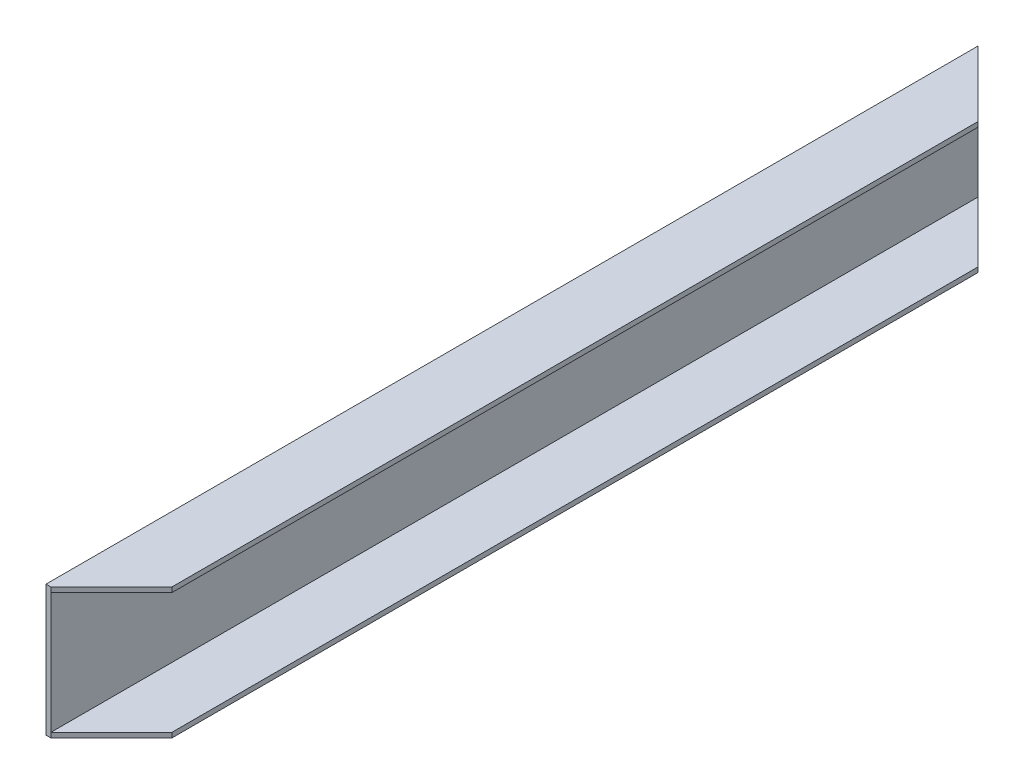
ISO-10303-21;
HEADER;
FILE_DESCRIPTION(('STEP AP214'),'2;1');
FILE_NAME('part.step','',(''),(''),'','','');
FILE_SCHEMA(('AUTOMOTIVE_DESIGN { 1 0 10303 214 1 1 1 1 }'));
ENDSEC;
DATA;
#1=APPLICATION_CONTEXT('core data for automotive mechanical design processes');
#2=APPLICATION_PROTOCOL_DEFINITION('international standard','automotive_design',2000,#1);
#3=PRODUCT_CONTEXT('',#1,'mechanical');
#4=PRODUCT('Part','Part','',(#3));
#5=PRODUCT_RELATED_PRODUCT_CATEGORY('part','',(#4));
#6=PRODUCT_DEFINITION_FORMATION('','',#4);
#7=PRODUCT_DEFINITION_CONTEXT('part definition',#1,'design');
#8=PRODUCT_DEFINITION('design','',#6,#7);
#9=PRODUCT_DEFINITION_SHAPE('','',#8);
#10=(LENGTH_UNIT() NAMED_UNIT(*) SI_UNIT(.MILLI.,.METRE.));
#11=(NAMED_UNIT(*) PLANE_ANGLE_UNIT() SI_UNIT($,.RADIAN.));
#12=(NAMED_UNIT(*) SI_UNIT($,.STERADIAN.) SOLID_ANGLE_UNIT());
#13=UNCERTAINTY_MEASURE_WITH_UNIT(LENGTH_MEASURE(1.E-05),#10,'distance_accuracy_value','');
#14=(GEOMETRIC_REPRESENTATION_CONTEXT(3) GLOBAL_UNCERTAINTY_ASSIGNED_CONTEXT((#13)) GLOBAL_UNIT_ASSIGNED_CONTEXT((#10,
#11,#12)) REPRESENTATION_CONTEXT('',''));
#15=CARTESIAN_POINT('',(0.,0.,0.));
#16=DIRECTION('',(0.,0.,1.));
#17=DIRECTION('',(1.,0.,0.));
#18=AXIS2_PLACEMENT_3D('',#15,#16,#17);
#19=CARTESIAN_POINT('',(0.,20.,142.5));
#20=DIRECTION('',(0.,-1.,0.));
#21=DIRECTION('',(0.,0.,-1.));
#22=AXIS2_PLACEMENT_3D('',#19,#20,#21);
#23=PLANE('',#22);
#24=DIRECTION('',(-1.,0.,0.));
#25=VECTOR('',#24,1.);
#26=CARTESIAN_POINT('',(0.,20.,142.5));
#27=LINE('',#26,#25);
#28=CARTESIAN_POINT('',(1.5,20.,142.5));
#29=VERTEX_POINT('',#28);
#30=CARTESIAN_POINT('',(0.,20.,142.5));
#31=VERTEX_POINT('',#30);
#32=EDGE_CURVE('E113',#29,#31,#27,.T.);
#33=ORIENTED_EDGE('',*,*,#32,.F.);
#34=DIRECTION('',(0.707106781186548,0.,-0.707106781186548));
#35=VECTOR('',#34,1.);
#36=CARTESIAN_POINT('',(0.750000000000004,20.,143.25));
#37=LINE('',#36,#35);
#38=CARTESIAN_POINT('',(20.,20.,124.));
#39=VERTEX_POINT('',#38);
#40=EDGE_CURVE('E47',#29,#39,#37,.T.);
#41=ORIENTED_EDGE('',*,*,#40,.T.);
#42=DIRECTION('',(0.,0.,-1.));
#43=VECTOR('',#42,1.);
#44=CARTESIAN_POINT('',(20.,20.,142.5));
#45=LINE('',#44,#43);
#46=CARTESIAN_POINT('',(20.,20.,-122.5));
#47=VERTEX_POINT('',#46);
#48=EDGE_CURVE('E121',#39,#47,#45,.T.);
#49=ORIENTED_EDGE('',*,*,#48,.T.);
#50=DIRECTION('',(-0.707106781186548,0.,-0.707106781186547));
#51=VECTOR('',#50,1.);
#52=CARTESIAN_POINT('',(142.5,20.,0.));
#53=LINE('',#52,#51);
#54=CARTESIAN_POINT('',(0.,20.,-142.5));
#55=VERTEX_POINT('',#54);
#56=EDGE_CURVE('E107',#47,#55,#53,.T.);
#57=ORIENTED_EDGE('',*,*,#56,.T.);
#58=DIRECTION('',(0.,0.,-1.));
#59=VECTOR('',#58,1.);
#60=CARTESIAN_POINT('',(0.,20.,142.5));
#61=LINE('',#60,#59);
#62=EDGE_CURVE('E119',#31,#55,#61,.T.);
#63=ORIENTED_EDGE('',*,*,#62,.F.);
#64=EDGE_LOOP('',(#33,#41,#49,#57,#63));
#65=FACE_BOUND('',#64,.T.);
#66=ADVANCED_FACE('F33',(#65),#23,.F.);
#67=CARTESIAN_POINT('',(0.,20.,142.5));
#68=DIRECTION('',(1.,0.,0.));
#69=DIRECTION('',(0.,0.,-1.));
#70=AXIS2_PLACEMENT_3D('',#67,#68,#69);
#71=PLANE('',#70);
#72=DIRECTION('',(0.,-1.,0.));
#73=VECTOR('',#72,1.);
#74=CARTESIAN_POINT('',(0.,20.,-142.5));
#75=LINE('',#74,#73);
#76=CARTESIAN_POINT('',(0.,-20.,-142.5));
#77=VERTEX_POINT('',#76);
#78=EDGE_CURVE('E104',#55,#77,#75,.T.);
#79=ORIENTED_EDGE('',*,*,#78,.T.);
#80=DIRECTION('',(0.,0.,-1.));
#81=VECTOR('',#80,1.);
#82=CARTESIAN_POINT('',(0.,-20.,142.5));
#83=LINE('',#82,#81);
#84=CARTESIAN_POINT('',(0.,-20.,142.5));
#85=VERTEX_POINT('',#84);
#86=EDGE_CURVE('E127',#85,#77,#83,.T.);
#87=ORIENTED_EDGE('',*,*,#86,.F.);
#88=DIRECTION('',(0.,-1.,0.));
#89=VECTOR('',#88,1.);
#90=CARTESIAN_POINT('',(0.,20.,142.5));
#91=LINE('',#90,#89);
#92=EDGE_CURVE('E126',#31,#85,#91,.T.);
#93=ORIENTED_EDGE('',*,*,#92,.F.);
#94=ORIENTED_EDGE('',*,*,#62,.T.);
#95=EDGE_LOOP('',(#79,#87,#93,#94));
#96=FACE_BOUND('',#95,.T.);
#97=ADVANCED_FACE('F125',(#96),#71,.F.);
#98=CARTESIAN_POINT('',(0.,-20.,142.5));
#99=DIRECTION('',(0.,1.,0.));
#100=DIRECTION('',(0.,0.,1.));
#101=AXIS2_PLACEMENT_3D('',#98,#99,#100);
#102=PLANE('',#101);
#103=DIRECTION('',(0.,0.,-1.));
#104=VECTOR('',#103,1.);
#105=CARTESIAN_POINT('',(20.,-20.,142.5));
#106=LINE('',#105,#104);
#107=CARTESIAN_POINT('',(20.,-20.,124.));
#108=VERTEX_POINT('',#107);
#109=CARTESIAN_POINT('',(20.,-20.,-122.5));
#110=VERTEX_POINT('',#109);
#111=EDGE_CURVE('E128',#108,#110,#106,.T.);
#112=ORIENTED_EDGE('',*,*,#111,.F.);
#113=DIRECTION('',(-0.707106781186548,0.,0.707106781186548));
#114=VECTOR('',#113,1.);
#115=CARTESIAN_POINT('',(0.750000000000004,-20.,143.25));
#116=LINE('',#115,#114);
#117=CARTESIAN_POINT('',(1.5,-20.,142.5));
#118=VERTEX_POINT('',#117);
#119=EDGE_CURVE('E155',#108,#118,#116,.T.);
#120=ORIENTED_EDGE('',*,*,#119,.T.);
#121=DIRECTION('',(1.,0.,0.));
#122=VECTOR('',#121,1.);
#123=CARTESIAN_POINT('',(0.,-20.,142.5));
#124=LINE('',#123,#122);
#125=EDGE_CURVE('E149',#85,#118,#124,.T.);
#126=ORIENTED_EDGE('',*,*,#125,.F.);
#127=ORIENTED_EDGE('',*,*,#86,.T.);
#128=DIRECTION('',(0.707106781186548,0.,0.707106781186547));
#129=VECTOR('',#128,1.);
#130=CARTESIAN_POINT('',(142.5,-20.,0.));
#131=LINE('',#130,#129);
#132=EDGE_CURVE('E68',#77,#110,#131,.T.);
#133=ORIENTED_EDGE('',*,*,#132,.T.);
#134=EDGE_LOOP('',(#112,#120,#126,#127,#133));
#135=FACE_BOUND('',#134,.T.);
#136=ADVANCED_FACE('F194',(#135),#102,.F.);
#137=CARTESIAN_POINT('',(20.,-20.,142.5));
#138=DIRECTION('',(-1.,0.,0.));
#139=DIRECTION('',(0.,-1.,0.));
#140=AXIS2_PLACEMENT_3D('',#137,#138,#139);
#141=PLANE('',#140);
#142=DIRECTION('',(0.,0.,-1.));
#143=VECTOR('',#142,1.);
#144=CARTESIAN_POINT('',(20.,-18.5,142.5));
#145=LINE('',#144,#143);
#146=CARTESIAN_POINT('',(20.,-18.5,124.));
#147=VERTEX_POINT('',#146);
#148=CARTESIAN_POINT('',(20.,-18.5,-122.5));
#149=VERTEX_POINT('',#148);
#150=EDGE_CURVE('E133',#147,#149,#145,.T.);
#151=ORIENTED_EDGE('',*,*,#150,.F.);
#152=DIRECTION('',(0.,1.,0.));
#153=VECTOR('',#152,1.);
#154=CARTESIAN_POINT('',(20.,-30.,124.));
#155=LINE('',#154,#153);
#156=EDGE_CURVE('E170',#108,#147,#155,.T.);
#157=ORIENTED_EDGE('',*,*,#156,.F.);
#158=ORIENTED_EDGE('',*,*,#111,.T.);
#159=DIRECTION('',(0.,1.,0.));
#160=VECTOR('',#159,1.);
#161=CARTESIAN_POINT('',(20.,-30.,-122.5));
#162=LINE('',#161,#160);
#163=EDGE_CURVE('E173',#110,#149,#162,.T.);
#164=ORIENTED_EDGE('',*,*,#163,.T.);
#165=EDGE_LOOP('',(#151,#157,#158,#164));
#166=FACE_BOUND('',#165,.T.);
#167=ADVANCED_FACE('F179',(#166),#141,.F.);
#168=CARTESIAN_POINT('',(20.,-18.5,142.5));
#169=DIRECTION('',(0.,-1.,0.));
#170=DIRECTION('',(1.,0.,0.));
#171=AXIS2_PLACEMENT_3D('',#168,#169,#170);
#172=PLANE('',#171);
#173=DIRECTION('',(0.,0.,-1.));
#174=VECTOR('',#173,1.);
#175=CARTESIAN_POINT('',(1.5,-18.5,142.5));
#176=LINE('',#175,#174);
#177=CARTESIAN_POINT('',(1.5,-18.5,142.5));
#178=VERTEX_POINT('',#177);
#179=CARTESIAN_POINT('',(1.5,-18.5,-141.));
#180=VERTEX_POINT('',#179);
#181=EDGE_CURVE('E136',#178,#180,#176,.T.);
#182=ORIENTED_EDGE('',*,*,#181,.F.);
#183=DIRECTION('',(0.707106781186548,0.,-0.707106781186548));
#184=VECTOR('',#183,1.);
#185=CARTESIAN_POINT('',(10.75,-18.5,133.25));
#186=LINE('',#185,#184);
#187=EDGE_CURVE('E56',#178,#147,#186,.T.);
#188=ORIENTED_EDGE('',*,*,#187,.T.);
#189=ORIENTED_EDGE('',*,*,#150,.T.);
#190=DIRECTION('',(-0.707106781186548,0.,-0.707106781186547));
#191=VECTOR('',#190,1.);
#192=CARTESIAN_POINT('',(152.5,-18.5,9.99999999999993));
#193=LINE('',#192,#191);
#194=EDGE_CURVE('E161',#149,#180,#193,.T.);
#195=ORIENTED_EDGE('',*,*,#194,.T.);
#196=EDGE_LOOP('',(#182,#188,#189,#195));
#197=FACE_BOUND('',#196,.T.);
#198=ADVANCED_FACE('F184',(#197),#172,.F.);
#199=CARTESIAN_POINT('',(1.5,18.5,142.5));
#200=DIRECTION('',(-1.,0.,0.));
#201=DIRECTION('',(0.,0.,1.));
#202=AXIS2_PLACEMENT_3D('',#199,#200,#201);
#203=PLANE('',#202);
#204=ORIENTED_EDGE('',*,*,#181,.T.);
#205=DIRECTION('',(0.,1.,0.));
#206=VECTOR('',#205,1.);
#207=CARTESIAN_POINT('',(1.5,18.5,-141.));
#208=LINE('',#207,#206);
#209=CARTESIAN_POINT('',(1.5,18.5,-141.));
#210=VERTEX_POINT('',#209);
#211=EDGE_CURVE('E164',#180,#210,#208,.T.);
#212=ORIENTED_EDGE('',*,*,#211,.T.);
#213=DIRECTION('',(0.,0.,-1.));
#214=VECTOR('',#213,1.);
#215=CARTESIAN_POINT('',(1.5,18.5,142.5));
#216=LINE('',#215,#214);
#217=CARTESIAN_POINT('',(1.5,18.5,142.5));
#218=VERTEX_POINT('',#217);
#219=EDGE_CURVE('E139',#218,#210,#216,.T.);
#220=ORIENTED_EDGE('',*,*,#219,.F.);
#221=DIRECTION('',(0.,1.,0.));
#222=VECTOR('',#221,1.);
#223=CARTESIAN_POINT('',(1.5,18.5,142.5));
#224=LINE('',#223,#222);
#225=EDGE_CURVE('E145',#178,#218,#224,.T.);
#226=ORIENTED_EDGE('',*,*,#225,.F.);
#227=EDGE_LOOP('',(#204,#212,#220,#226));
#228=FACE_BOUND('',#227,.T.);
#229=ADVANCED_FACE('F188',(#228),#203,.F.);
#230=CARTESIAN_POINT('',(20.,18.5,142.5));
#231=DIRECTION('',(0.,1.,0.));
#232=DIRECTION('',(-1.,0.,0.));
#233=AXIS2_PLACEMENT_3D('',#230,#231,#232);
#234=PLANE('',#233);
#235=DIRECTION('',(0.,0.,-1.));
#236=VECTOR('',#235,1.);
#237=CARTESIAN_POINT('',(20.,18.5,142.5));
#238=LINE('',#237,#236);
#239=CARTESIAN_POINT('',(20.,18.5,124.));
#240=VERTEX_POINT('',#239);
#241=CARTESIAN_POINT('',(20.,18.5,-122.5));
#242=VERTEX_POINT('',#241);
#243=EDGE_CURVE('E142',#240,#242,#238,.T.);
#244=ORIENTED_EDGE('',*,*,#243,.F.);
#245=DIRECTION('',(-0.707106781186548,0.,0.707106781186548));
#246=VECTOR('',#245,1.);
#247=CARTESIAN_POINT('',(10.75,18.5,133.25));
#248=LINE('',#247,#246);
#249=EDGE_CURVE('E122',#240,#218,#248,.T.);
#250=ORIENTED_EDGE('',*,*,#249,.T.);
#251=ORIENTED_EDGE('',*,*,#219,.T.);
#252=DIRECTION('',(0.707106781186548,0.,0.707106781186547));
#253=VECTOR('',#252,1.);
#254=CARTESIAN_POINT('',(152.5,18.5,9.99999999999993));
#255=LINE('',#254,#253);
#256=EDGE_CURVE('E167',#210,#242,#255,.T.);
#257=ORIENTED_EDGE('',*,*,#256,.T.);
#258=EDGE_LOOP('',(#244,#250,#251,#257));
#259=FACE_BOUND('',#258,.T.);
#260=ADVANCED_FACE('F236',(#259),#234,.F.);
#261=CARTESIAN_POINT('',(20.,20.,142.5));
#262=DIRECTION('',(-1.,0.,0.));
#263=DIRECTION('',(0.,-1.,0.));
#264=AXIS2_PLACEMENT_3D('',#261,#262,#263);
#265=PLANE('',#264);
#266=ORIENTED_EDGE('',*,*,#48,.F.);
#267=EDGE_CURVE('E174',#240,#39,#155,.T.);
#268=ORIENTED_EDGE('',*,*,#267,.F.);
#269=ORIENTED_EDGE('',*,*,#243,.T.);
#270=EDGE_CURVE('E171',#242,#47,#162,.T.);
#271=ORIENTED_EDGE('',*,*,#270,.T.);
#272=EDGE_LOOP('',(#266,#268,#269,#271));
#273=FACE_BOUND('',#272,.T.);
#274=ADVANCED_FACE('F245',(#273),#265,.F.);
#275=CARTESIAN_POINT('',(0.,0.,142.5));
#276=DIRECTION('',(0.,0.,-1.));
#277=DIRECTION('',(-1.,0.,0.));
#278=AXIS2_PLACEMENT_3D('',#275,#276,#277);
#279=PLANE('',#278);
#280=ORIENTED_EDGE('',*,*,#125,.T.);
#281=DIRECTION('',(0.,1.,0.));
#282=VECTOR('',#281,1.);
#283=CARTESIAN_POINT('',(1.5,0.,142.5));
#284=LINE('',#283,#282);
#285=EDGE_CURVE('E11',#118,#178,#284,.T.);
#286=ORIENTED_EDGE('',*,*,#285,.T.);
#287=ORIENTED_EDGE('',*,*,#225,.T.);
#288=EDGE_CURVE('E36',#218,#29,#284,.T.);
#289=ORIENTED_EDGE('',*,*,#288,.T.);
#290=ORIENTED_EDGE('',*,*,#32,.T.);
#291=ORIENTED_EDGE('',*,*,#92,.T.);
#292=EDGE_LOOP('',(#280,#286,#287,#289,#290,#291));
#293=FACE_BOUND('',#292,.T.);
#294=ADVANCED_FACE('F190',(#293),#279,.F.);
#295=CARTESIAN_POINT('',(0.,-30.,-142.5));
#296=DIRECTION('',(-0.707106781186547,0.,0.707106781186548));
#297=DIRECTION('',(0.707106781186548,0.,0.707106781186547));
#298=AXIS2_PLACEMENT_3D('',#295,#296,#297);
#299=PLANE('',#298);
#300=ORIENTED_EDGE('',*,*,#270,.F.);
#301=ORIENTED_EDGE('',*,*,#256,.F.);
#302=ORIENTED_EDGE('',*,*,#211,.F.);
#303=ORIENTED_EDGE('',*,*,#194,.F.);
#304=ORIENTED_EDGE('',*,*,#163,.F.);
#305=ORIENTED_EDGE('',*,*,#132,.F.);
#306=ORIENTED_EDGE('',*,*,#78,.F.);
#307=ORIENTED_EDGE('',*,*,#56,.F.);
#308=EDGE_LOOP('',(#300,#301,#302,#303,#304,#305,#306,#307));
#309=FACE_BOUND('',#308,.T.);
#310=ADVANCED_FACE('F106',(#309),#299,.F.);
#311=CARTESIAN_POINT('',(1.5,-30.,142.5));
#312=DIRECTION('',(-0.707106781186548,0.,-0.707106781186548));
#313=DIRECTION('',(-0.707106781186548,0.,0.707106781186548));
#314=AXIS2_PLACEMENT_3D('',#311,#312,#313);
#315=PLANE('',#314);
#316=ORIENTED_EDGE('',*,*,#288,.F.);
#317=ORIENTED_EDGE('',*,*,#249,.F.);
#318=ORIENTED_EDGE('',*,*,#267,.T.);
#319=ORIENTED_EDGE('',*,*,#40,.F.);
#320=EDGE_LOOP('',(#316,#317,#318,#319));
#321=FACE_BOUND('',#320,.T.);
#322=ADVANCED_FACE('F272',(#321),#315,.F.);
#323=ORIENTED_EDGE('',*,*,#156,.T.);
#324=ORIENTED_EDGE('',*,*,#187,.F.);
#325=ORIENTED_EDGE('',*,*,#285,.F.);
#326=ORIENTED_EDGE('',*,*,#119,.F.);
#327=EDGE_LOOP('',(#323,#324,#325,#326));
#328=FACE_BOUND('',#327,.T.);
#329=ADVANCED_FACE('F192',(#328),#315,.F.);
#330=CLOSED_SHELL('',(#66,#97,#136,#167,#198,#229,#260,#274,#294,#310,#322,#329));
#331=MANIFOLD_SOLID_BREP('B2',#330);
#332=ADVANCED_BREP_SHAPE_REPRESENTATION('',(#18,#331),#14);
#333=SHAPE_DEFINITION_REPRESENTATION(#9,#332);
ENDSEC;
END-ISO-10303-21;
